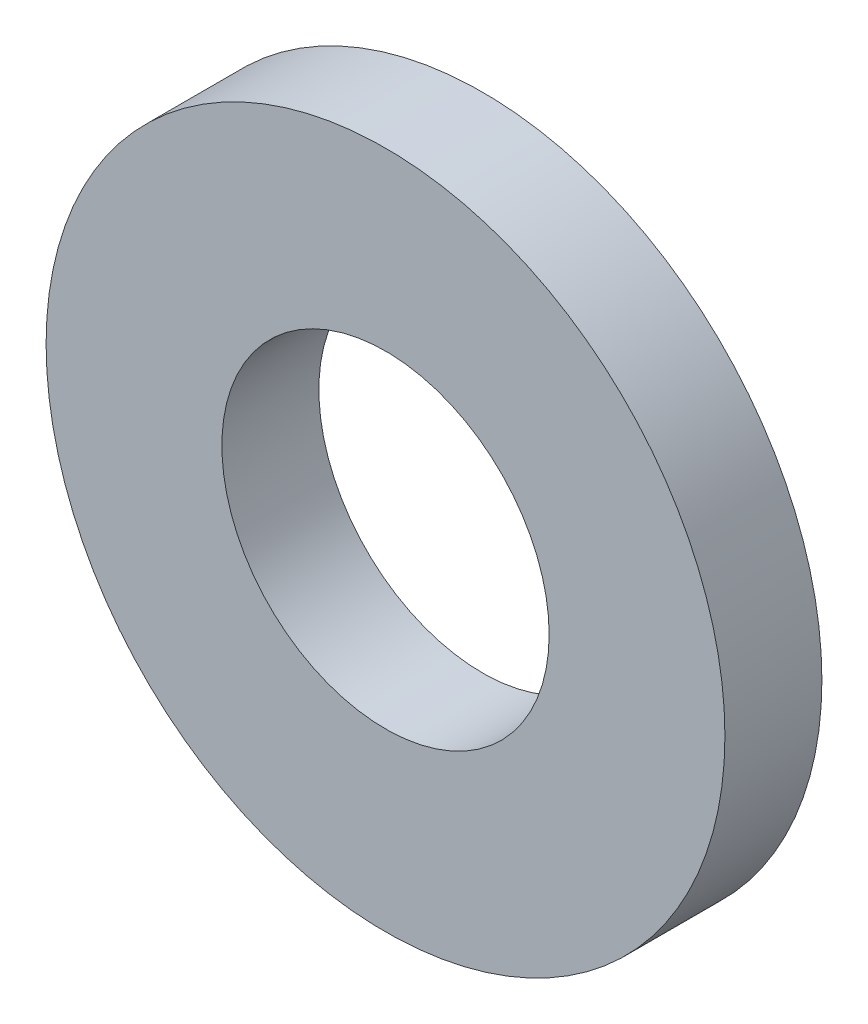
ISO-10303-21;
HEADER;
FILE_DESCRIPTION(('STEP AP214'),'2;1');
FILE_NAME('part.step','',(''),(''),'','','');
FILE_SCHEMA(('AUTOMOTIVE_DESIGN { 1 0 10303 214 1 1 1 1 }'));
ENDSEC;
DATA;
#1=APPLICATION_CONTEXT('core data for automotive mechanical design processes');
#2=APPLICATION_PROTOCOL_DEFINITION('international standard','automotive_design',2000,#1);
#3=PRODUCT_CONTEXT('',#1,'mechanical');
#4=PRODUCT('Part','Part','',(#3));
#5=PRODUCT_RELATED_PRODUCT_CATEGORY('part','',(#4));
#6=PRODUCT_DEFINITION_FORMATION('','',#4);
#7=PRODUCT_DEFINITION_CONTEXT('part definition',#1,'design');
#8=PRODUCT_DEFINITION('design','',#6,#7);
#9=PRODUCT_DEFINITION_SHAPE('','',#8);
#10=(LENGTH_UNIT() NAMED_UNIT(*) SI_UNIT(.MILLI.,.METRE.));
#11=(NAMED_UNIT(*) PLANE_ANGLE_UNIT() SI_UNIT($,.RADIAN.));
#12=(NAMED_UNIT(*) SI_UNIT($,.STERADIAN.) SOLID_ANGLE_UNIT());
#13=UNCERTAINTY_MEASURE_WITH_UNIT(LENGTH_MEASURE(1.E-05),#10,'distance_accuracy_value','');
#14=(GEOMETRIC_REPRESENTATION_CONTEXT(3) GLOBAL_UNCERTAINTY_ASSIGNED_CONTEXT((#13)) GLOBAL_UNIT_ASSIGNED_CONTEXT((#10,
#11,#12)) REPRESENTATION_CONTEXT('',''));
#15=CARTESIAN_POINT('',(0.,0.,0.));
#16=DIRECTION('',(0.,0.,1.));
#17=DIRECTION('',(1.,0.,0.));
#18=AXIS2_PLACEMENT_3D('',#15,#16,#17);
#19=CARTESIAN_POINT('',(0.,0.,0.4));
#20=DIRECTION('',(0.,0.,1.));
#21=DIRECTION('',(1.,0.,0.));
#22=AXIS2_PLACEMENT_3D('',#19,#20,#21);
#23=PLANE('',#22);
#24=CARTESIAN_POINT('',(0.,0.,0.4));
#25=DIRECTION('',(0.,0.,1.));
#26=DIRECTION('',(1.,0.,0.));
#27=AXIS2_PLACEMENT_3D('',#24,#25,#26);
#28=CIRCLE('',#27,2.8);
#29=CARTESIAN_POINT('',(2.8,0.,0.4));
#30=VERTEX_POINT('',#29);
#31=EDGE_CURVE('E10',#30,#30,#28,.T.);
#32=ORIENTED_EDGE('',*,*,#31,.T.);
#33=EDGE_LOOP('',(#32));
#34=FACE_BOUND('',#33,.T.);
#35=CARTESIAN_POINT('',(0.,0.,0.4));
#36=DIRECTION('',(0.,0.,1.));
#37=DIRECTION('',(1.,0.,0.));
#38=AXIS2_PLACEMENT_3D('',#35,#36,#37);
#39=CIRCLE('',#38,1.35);
#40=CARTESIAN_POINT('',(1.35,0.,0.4));
#41=VERTEX_POINT('',#40);
#42=EDGE_CURVE('E41',#41,#41,#39,.T.);
#43=ORIENTED_EDGE('',*,*,#42,.F.);
#44=EDGE_LOOP('',(#43));
#45=FACE_BOUND('',#44,.T.);
#46=ADVANCED_FACE('F30',(#34,#45),#23,.T.);
#47=CARTESIAN_POINT('',(0.,0.,-0.4));
#48=DIRECTION('',(0.,0.,1.));
#49=DIRECTION('',(1.,0.,0.));
#50=AXIS2_PLACEMENT_3D('',#47,#48,#49);
#51=PLANE('',#50);
#52=CARTESIAN_POINT('',(0.,0.,-0.4));
#53=DIRECTION('',(0.,0.,1.));
#54=DIRECTION('',(1.,0.,0.));
#55=AXIS2_PLACEMENT_3D('',#52,#53,#54);
#56=CIRCLE('',#55,2.8);
#57=CARTESIAN_POINT('',(2.8,0.,-0.4));
#58=VERTEX_POINT('',#57);
#59=EDGE_CURVE('E34',#58,#58,#56,.T.);
#60=ORIENTED_EDGE('',*,*,#59,.F.);
#61=EDGE_LOOP('',(#60));
#62=FACE_BOUND('',#61,.T.);
#63=CARTESIAN_POINT('',(0.,0.,-0.4));
#64=DIRECTION('',(0.,0.,1.));
#65=DIRECTION('',(1.,0.,0.));
#66=AXIS2_PLACEMENT_3D('',#63,#64,#65);
#67=CIRCLE('',#66,1.35);
#68=CARTESIAN_POINT('',(1.35,0.,-0.4));
#69=VERTEX_POINT('',#68);
#70=EDGE_CURVE('E43',#69,#69,#67,.T.);
#71=ORIENTED_EDGE('',*,*,#70,.T.);
#72=EDGE_LOOP('',(#71));
#73=FACE_BOUND('',#72,.T.);
#74=ADVANCED_FACE('F53',(#62,#73),#51,.F.);
#75=CARTESIAN_POINT('',(0.,0.,0.4));
#76=DIRECTION('',(0.,0.,-1.));
#77=DIRECTION('',(-1.,0.,0.));
#78=AXIS2_PLACEMENT_3D('',#75,#76,#77);
#79=CYLINDRICAL_SURFACE('',#78,2.8);
#80=ORIENTED_EDGE('',*,*,#31,.F.);
#81=EDGE_LOOP('',(#80));
#82=FACE_BOUND('',#81,.T.);
#83=ORIENTED_EDGE('',*,*,#59,.T.);
#84=EDGE_LOOP('',(#83));
#85=FACE_BOUND('',#84,.T.);
#86=ADVANCED_FACE('F32',(#82,#85),#79,.T.);
#87=CARTESIAN_POINT('',(0.,0.,0.4));
#88=DIRECTION('',(0.,0.,-1.));
#89=DIRECTION('',(-1.,0.,0.));
#90=AXIS2_PLACEMENT_3D('',#87,#88,#89);
#91=CYLINDRICAL_SURFACE('',#90,1.35);
#92=ORIENTED_EDGE('',*,*,#42,.T.);
#93=EDGE_LOOP('',(#92));
#94=FACE_BOUND('',#93,.T.);
#95=ORIENTED_EDGE('',*,*,#70,.F.);
#96=EDGE_LOOP('',(#95));
#97=FACE_BOUND('',#96,.T.);
#98=ADVANCED_FACE('F49',(#94,#97),#91,.F.);
#99=CLOSED_SHELL('',(#46,#74,#86,#98));
#100=MANIFOLD_SOLID_BREP('B2',#99);
#101=ADVANCED_BREP_SHAPE_REPRESENTATION('',(#18,#100),#14);
#102=SHAPE_DEFINITION_REPRESENTATION(#9,#101);
ENDSEC;
END-ISO-10303-21;
